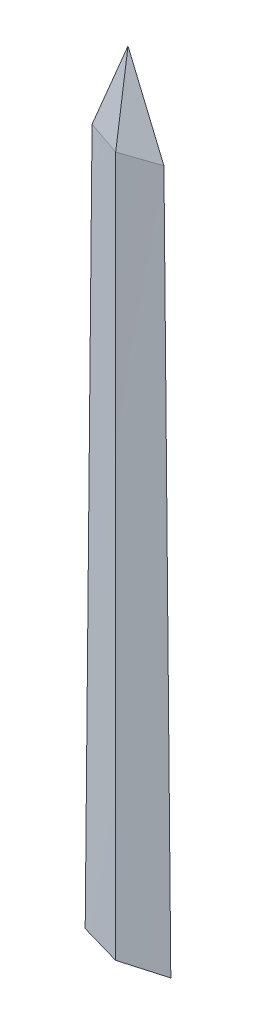
ISO-10303-21;
HEADER;
FILE_DESCRIPTION(('STEP AP214'),'2;1');
FILE_NAME('part.step','',(''),(''),'','','');
FILE_SCHEMA(('AUTOMOTIVE_DESIGN { 1 0 10303 214 1 1 1 1 }'));
ENDSEC;
DATA;
#1=APPLICATION_CONTEXT('core data for automotive mechanical design processes');
#2=APPLICATION_PROTOCOL_DEFINITION('international standard','automotive_design',2000,#1);
#3=PRODUCT_CONTEXT('',#1,'mechanical');
#4=PRODUCT('Part','Part','',(#3));
#5=PRODUCT_RELATED_PRODUCT_CATEGORY('part','',(#4));
#6=PRODUCT_DEFINITION_FORMATION('','',#4);
#7=PRODUCT_DEFINITION_CONTEXT('part definition',#1,'design');
#8=PRODUCT_DEFINITION('design','',#6,#7);
#9=PRODUCT_DEFINITION_SHAPE('','',#8);
#10=(LENGTH_UNIT() NAMED_UNIT(*) SI_UNIT(.MILLI.,.METRE.));
#11=(NAMED_UNIT(*) PLANE_ANGLE_UNIT() SI_UNIT($,.RADIAN.));
#12=(NAMED_UNIT(*) SI_UNIT($,.STERADIAN.) SOLID_ANGLE_UNIT());
#13=UNCERTAINTY_MEASURE_WITH_UNIT(LENGTH_MEASURE(1.E-05),#10,'distance_accuracy_value','');
#14=(GEOMETRIC_REPRESENTATION_CONTEXT(3) GLOBAL_UNCERTAINTY_ASSIGNED_CONTEXT((#13)) GLOBAL_UNIT_ASSIGNED_CONTEXT((#10,
#11,#12)) REPRESENTATION_CONTEXT('',''));
#15=CARTESIAN_POINT('',(0.,0.,0.));
#16=DIRECTION('',(0.,0.,1.));
#17=DIRECTION('',(1.,0.,0.));
#18=AXIS2_PLACEMENT_3D('',#15,#16,#17);
#19=CARTESIAN_POINT('',(-32.1030984066137,13.457832355646,-93.6987043311591));
#20=DIRECTION('',(-0.321172823266874,0.13463778349272,-0.937401026696127));
#21=DIRECTION('',(0.946014601230734,0.,-0.3241240106167));
#22=AXIS2_PLACEMENT_3D('',#19,#20,#21);
#23=PLANE('',#22);
#24=DIRECTION('',(0.386610447032503,0.922243114501447,0.));
#25=VECTOR('',#24,1.);
#26=CARTESIAN_POINT('',(181.068628680817,1174.33721565241,0.));
#27=LINE('',#26,#25);
#28=CARTESIAN_POINT('',(148.634785732328,1096.96763455169,0.));
#29=VERTEX_POINT('',#28);
#30=CARTESIAN_POINT('',(181.068628680818,1174.33721565241,0.));
#31=VERTEX_POINT('',#30);
#32=EDGE_CURVE('E118',#29,#31,#27,.T.);
#33=ORIENTED_EDGE('',*,*,#32,.T.);
#34=DIRECTION('',(0.,-0.989842276180155,-0.14216985716561));
#35=VECTOR('',#34,1.);
#36=CARTESIAN_POINT('',(181.068628680818,23.7360188615762,-165.259467835217));
#37=LINE('',#36,#35);
#38=CARTESIAN_POINT('',(181.068628680817,1096.96763455169,-11.1125));
#39=VERTEX_POINT('',#38);
#40=EDGE_CURVE('E12',#31,#39,#37,.T.);
#41=ORIENTED_EDGE('',*,*,#40,.T.);
#42=DIRECTION('',(-0.946014601230734,0.,0.3241240106167));
#43=VECTOR('',#42,1.);
#44=CARTESIAN_POINT('',(181.068628680817,1096.96763455169,-11.1125));
#45=LINE('',#44,#43);
#46=EDGE_CURVE('E120',#39,#29,#45,.T.);
#47=ORIENTED_EDGE('',*,*,#46,.T.);
#48=EDGE_LOOP('',(#33,#41,#47));
#49=FACE_BOUND('',#48,.T.);
#50=ADVANCED_FACE('F61',(#49),#23,.T.);
#51=CARTESIAN_POINT('',(-32.1030984066137,13.457832355646,93.6987043311591));
#52=DIRECTION('',(-0.321172823266874,0.13463778349272,0.937401026696127));
#53=DIRECTION('',(0.946014601230734,0.,0.3241240106167));
#54=AXIS2_PLACEMENT_3D('',#51,#52,#53);
#55=PLANE('',#54);
#56=DIRECTION('',(-0.946014601230734,0.,-0.3241240106167));
#57=VECTOR('',#56,1.);
#58=CARTESIAN_POINT('',(181.068628680817,1096.96763455169,11.1125));
#59=LINE('',#58,#57);
#60=CARTESIAN_POINT('',(181.068628680818,1096.96763455169,11.1125));
#61=VERTEX_POINT('',#60);
#62=EDGE_CURVE('E135',#61,#29,#59,.T.);
#63=ORIENTED_EDGE('',*,*,#62,.F.);
#64=DIRECTION('',(0.,0.989842276180155,-0.14216985716561));
#65=VECTOR('',#64,1.);
#66=CARTESIAN_POINT('',(181.068628680818,23.7360188615762,165.259467835217));
#67=LINE('',#66,#65);
#68=EDGE_CURVE('E71',#61,#31,#67,.T.);
#69=ORIENTED_EDGE('',*,*,#68,.T.);
#70=ORIENTED_EDGE('',*,*,#32,.F.);
#71=EDGE_LOOP('',(#63,#69,#70));
#72=FACE_BOUND('',#71,.T.);
#73=ADVANCED_FACE('F133',(#72),#55,.T.);
#74=CARTESIAN_POINT('',(142.421230690097,465.168027231046,-11.1125));
#75=DIRECTION('',(0.,-1.,0.));
#76=DIRECTION('',(0.,0.,-1.));
#77=AXIS2_PLACEMENT_3D('',#74,#75,#76);
#78=PLANE('',#77);
#79=CARTESIAN_POINT('',(181.068628680817,465.168027231046,0.));
#80=DIRECTION('',(0.,-1.,0.));
#81=DIRECTION('',(0.,0.,-1.));
#82=AXIS2_PLACEMENT_3D('',#79,#80,#81);
#83=CIRCLE('',#82,4.76250000000001);
#84=CARTESIAN_POINT('',(181.068628680817,465.168027231046,-4.76250000000001));
#85=VERTEX_POINT('',#84);
#86=EDGE_CURVE('E311',#85,#85,#83,.T.);
#87=ORIENTED_EDGE('',*,*,#86,.F.);
#88=EDGE_LOOP('',(#87));
#89=FACE_BOUND('',#88,.T.);
#90=DIRECTION('',(0.96106023622245,0.,0.276338962783115));
#91=VECTOR('',#90,1.);
#92=CARTESIAN_POINT('',(181.068628680817,465.168027231046,-11.1125));
#93=LINE('',#92,#91);
#94=CARTESIAN_POINT('',(181.068628680817,465.168027231046,-11.1125));
#95=VERTEX_POINT('',#94);
#96=CARTESIAN_POINT('',(219.716026671538,465.168027231046,0.));
#97=VERTEX_POINT('',#96);
#98=EDGE_CURVE('E162',#95,#97,#93,.T.);
#99=ORIENTED_EDGE('',*,*,#98,.T.);
#100=DIRECTION('',(0.96106023622245,0.,-0.276338962783115));
#101=VECTOR('',#100,1.);
#102=CARTESIAN_POINT('',(181.068628680817,465.168027231046,11.1125));
#103=LINE('',#102,#101);
#104=CARTESIAN_POINT('',(181.068628680817,465.168027231046,11.1125));
#105=VERTEX_POINT('',#104);
#106=EDGE_CURVE('E138',#105,#97,#103,.T.);
#107=ORIENTED_EDGE('',*,*,#106,.F.);
#108=DIRECTION('',(0.96106023622245,0.,0.276338962783115));
#109=VECTOR('',#108,1.);
#110=CARTESIAN_POINT('',(142.421230690097,465.168027231046,0.));
#111=LINE('',#110,#109);
#112=CARTESIAN_POINT('',(142.421230690097,465.168027231046,0.));
#113=VERTEX_POINT('',#112);
#114=EDGE_CURVE('E79',#113,#105,#111,.T.);
#115=ORIENTED_EDGE('',*,*,#114,.F.);
#116=DIRECTION('',(0.96106023622245,0.,-0.276338962783115));
#117=VECTOR('',#116,1.);
#118=CARTESIAN_POINT('',(142.421230690097,465.168027231046,0.));
#119=LINE('',#118,#117);
#120=EDGE_CURVE('E87',#113,#95,#119,.T.);
#121=ORIENTED_EDGE('',*,*,#120,.T.);
#122=EDGE_LOOP('',(#99,#107,#115,#121));
#123=FACE_BOUND('',#122,.T.);
#124=ADVANCED_FACE('F63',(#89,#123),#78,.T.);
#125=CARTESIAN_POINT('',(219.716026671538,465.168027231046,0.));
#126=CARTESIAN_POINT('',(213.502471629307,1096.96763455169,0.));
#127=CARTESIAN_POINT('',(213.274793673085,465.168027231046,1.85208333333331));
#128=CARTESIAN_POINT('',(208.096831137892,1096.96763455169,1.85208333333331));
#129=CARTESIAN_POINT('',(206.833560674631,465.168027231046,3.70416666666664));
#130=CARTESIAN_POINT('',(202.691190646477,1096.96763455169,3.70416666666663));
#131=CARTESIAN_POINT('',(193.951094677724,465.168027231046,7.4083333333333));
#132=CARTESIAN_POINT('',(191.879909663647,1096.96763455169,7.4083333333333));
#133=CARTESIAN_POINT('',(187.509861679271,465.168027231046,9.26041666666665));
#134=CARTESIAN_POINT('',(186.474269172232,1096.96763455169,9.26041666666665));
#135=CARTESIAN_POINT('',(181.068628680817,465.168027231046,11.1125));
#136=CARTESIAN_POINT('',(181.068628680817,1096.96763455169,11.1125));
#137=B_SPLINE_SURFACE_WITH_KNOTS('',3,1,((#125,#126),(#127,#128),(#129,#130),(#131,#132),(#133,
#134),(#135,#136)),.UNSPECIFIED.,.F.,.F.,.F.,(4,2,4),(2,2),(0.,0.5,1.),(0.,1.),.UNSPECIFIED.);
#138=DIRECTION('',(-0.00983421721197636,0.99995164291671,0.));
#139=VECTOR('',#138,1.);
#140=CARTESIAN_POINT('',(219.716026671538,465.168027231046,0.));
#141=LINE('',#140,#139);
#142=CARTESIAN_POINT('',(213.502471629307,1096.96763455169,0.));
#143=VERTEX_POINT('',#142);
#144=EDGE_CURVE('E158',#97,#143,#141,.T.);
#145=DIRECTION('',(-0.946014601230734,0.,0.3241240106167));
#146=VECTOR('',#145,1.);
#147=CARTESIAN_POINT('',(213.502471629307,1096.96763455169,0.));
#148=LINE('',#147,#146);
#149=EDGE_CURVE('E129',#143,#61,#148,.T.);
#150=DIRECTION('',(0.,1.,0.));
#151=VECTOR('',#150,1.);
#152=CARTESIAN_POINT('',(181.068628680817,781.067830891368,11.1125));
#153=LINE('',#152,#151);
#154=EDGE_CURVE('E242',#105,#61,#153,.T.);
#155=ORIENTED_EDGE('',*,*,#106,.T.);
#156=ORIENTED_EDGE('',*,*,#144,.T.);
#157=ORIENTED_EDGE('',*,*,#149,.T.);
#158=ORIENTED_EDGE('',*,*,#154,.F.);
#159=EDGE_LOOP('',(#155,#156,#157,#158));
#160=FACE_BOUND('',#159,.T.);
#161=ADVANCED_FACE('F200',(#160),#137,.F.);
#162=CARTESIAN_POINT('',(181.068628680817,465.168027231046,11.1125));
#163=CARTESIAN_POINT('',(181.068628680817,1096.96763455169,11.1125));
#164=CARTESIAN_POINT('',(174.627395682364,465.168027231046,9.26041666666668));
#165=CARTESIAN_POINT('',(175.662988189402,1096.96763455169,9.26041666666663));
#166=CARTESIAN_POINT('',(168.186162683911,465.168027231046,7.40833333333335));
#167=CARTESIAN_POINT('',(170.257347697988,1096.96763455169,7.40833333333328));
#168=CARTESIAN_POINT('',(155.303696687004,465.168027231046,3.70416666666668));
#169=CARTESIAN_POINT('',(159.446066715158,1096.96763455169,3.70416666666661));
#170=CARTESIAN_POINT('',(148.86246368855,465.168027231046,1.85208333333334));
#171=CARTESIAN_POINT('',(154.040426223743,1096.96763455169,1.8520833333333));
#172=CARTESIAN_POINT('',(142.421230690097,465.168027231046,0.));
#173=CARTESIAN_POINT('',(148.634785732328,1096.96763455169,0.));
#174=B_SPLINE_SURFACE_WITH_KNOTS('',3,1,((#162,#163),(#164,#165),(#166,#167),(#168,#169),(#170,
#171),(#172,#173)),.UNSPECIFIED.,.F.,.F.,.F.,(4,2,4),(2,2),(0.,0.5,1.),(0.,1.),.UNSPECIFIED.);
#175=DIRECTION('',(0.00983421721197636,0.99995164291671,0.));
#176=VECTOR('',#175,1.);
#177=CARTESIAN_POINT('',(145.528008211213,781.067830891368,0.));
#178=LINE('',#177,#176);
#179=EDGE_CURVE('E147',#113,#29,#178,.T.);
#180=ORIENTED_EDGE('',*,*,#114,.T.);
#181=ORIENTED_EDGE('',*,*,#154,.T.);
#182=ORIENTED_EDGE('',*,*,#62,.T.);
#183=ORIENTED_EDGE('',*,*,#179,.F.);
#184=EDGE_LOOP('',(#180,#181,#182,#183));
#185=FACE_BOUND('',#184,.T.);
#186=ADVANCED_FACE('F210',(#185),#174,.F.);
#187=CARTESIAN_POINT('',(219.716026671538,465.168027231046,0.));
#188=CARTESIAN_POINT('',(213.502471629307,1096.96763455169,0.));
#189=CARTESIAN_POINT('',(213.274793673085,465.168027231046,-1.85208333333331));
#190=CARTESIAN_POINT('',(208.096831137892,1096.96763455169,-1.85208333333331));
#191=CARTESIAN_POINT('',(206.833560674631,465.168027231046,-3.70416666666664));
#192=CARTESIAN_POINT('',(202.691190646477,1096.96763455169,-3.70416666666663));
#193=CARTESIAN_POINT('',(193.951094677724,465.168027231046,-7.4083333333333));
#194=CARTESIAN_POINT('',(191.879909663647,1096.96763455169,-7.4083333333333));
#195=CARTESIAN_POINT('',(187.509861679271,465.168027231046,-9.26041666666665));
#196=CARTESIAN_POINT('',(186.474269172232,1096.96763455169,-9.26041666666665));
#197=CARTESIAN_POINT('',(181.068628680817,465.168027231046,-11.1125));
#198=CARTESIAN_POINT('',(181.068628680817,1096.96763455169,-11.1125));
#199=B_SPLINE_SURFACE_WITH_KNOTS('',3,1,((#187,#188),(#189,#190),(#191,#192),(#193,#194),(#195,
#196),(#197,#198)),.UNSPECIFIED.,.F.,.F.,.F.,(4,2,4),(2,2),(0.,0.5,1.),(0.,1.),.UNSPECIFIED.);
#200=DIRECTION('',(0.,1.,0.));
#201=VECTOR('',#200,1.);
#202=CARTESIAN_POINT('',(181.068628680817,781.067830891368,-11.1125));
#203=LINE('',#202,#201);
#204=EDGE_CURVE('E165',#95,#39,#203,.T.);
#205=DIRECTION('',(-0.946014601230734,0.,-0.3241240106167));
#206=VECTOR('',#205,1.);
#207=CARTESIAN_POINT('',(213.502471629307,1096.96763455169,0.));
#208=LINE('',#207,#206);
#209=EDGE_CURVE('E65',#143,#39,#208,.T.);
#210=ORIENTED_EDGE('',*,*,#98,.F.);
#211=ORIENTED_EDGE('',*,*,#204,.T.);
#212=ORIENTED_EDGE('',*,*,#209,.F.);
#213=ORIENTED_EDGE('',*,*,#144,.F.);
#214=EDGE_LOOP('',(#210,#211,#212,#213));
#215=FACE_BOUND('',#214,.T.);
#216=ADVANCED_FACE('F195',(#215),#199,.T.);
#217=CARTESIAN_POINT('',(181.068628680817,465.168027231046,-11.1125));
#218=CARTESIAN_POINT('',(181.068628680817,1096.96763455169,-11.1125));
#219=CARTESIAN_POINT('',(174.627395682364,465.168027231046,-9.26041666666668));
#220=CARTESIAN_POINT('',(175.662988189402,1096.96763455169,-9.26041666666663));
#221=CARTESIAN_POINT('',(168.186162683911,465.168027231046,-7.40833333333335));
#222=CARTESIAN_POINT('',(170.257347697988,1096.96763455169,-7.40833333333328));
#223=CARTESIAN_POINT('',(155.303696687004,465.168027231046,-3.70416666666668));
#224=CARTESIAN_POINT('',(159.446066715158,1096.96763455169,-3.70416666666661));
#225=CARTESIAN_POINT('',(148.86246368855,465.168027231046,-1.85208333333334));
#226=CARTESIAN_POINT('',(154.040426223743,1096.96763455169,-1.8520833333333));
#227=CARTESIAN_POINT('',(142.421230690097,465.168027231046,0.));
#228=CARTESIAN_POINT('',(148.634785732328,1096.96763455169,0.));
#229=B_SPLINE_SURFACE_WITH_KNOTS('',3,1,((#217,#218),(#219,#220),(#221,#222),(#223,#224),(#225,
#226),(#227,#228)),.UNSPECIFIED.,.F.,.F.,.F.,(4,2,4),(2,2),(0.,0.5,1.),(0.,1.),.UNSPECIFIED.);
#230=ORIENTED_EDGE('',*,*,#120,.F.);
#231=ORIENTED_EDGE('',*,*,#179,.T.);
#232=ORIENTED_EDGE('',*,*,#46,.F.);
#233=ORIENTED_EDGE('',*,*,#204,.F.);
#234=EDGE_LOOP('',(#230,#231,#232,#233));
#235=FACE_BOUND('',#234,.T.);
#236=ADVANCED_FACE('F183',(#235),#229,.T.);
#237=CARTESIAN_POINT('',(69.4582744062542,29.1173705675479,202.726547902408));
#238=DIRECTION('',(0.321172823266876,0.13463778349272,0.937401026696127));
#239=DIRECTION('',(0.946014601230734,0.,-0.324124010616702));
#240=AXIS2_PLACEMENT_3D('',#237,#238,#239);
#241=PLANE('',#240);
#242=ORIENTED_EDGE('',*,*,#68,.F.);
#243=ORIENTED_EDGE('',*,*,#149,.F.);
#244=DIRECTION('',(0.386610447032503,-0.922243114501447,0.));
#245=VECTOR('',#244,1.);
#246=CARTESIAN_POINT('',(213.502471629307,1096.96763455169,0.));
#247=LINE('',#246,#245);
#248=EDGE_CURVE('E111',#31,#143,#247,.T.);
#249=ORIENTED_EDGE('',*,*,#248,.F.);
#250=EDGE_LOOP('',(#242,#243,#249));
#251=FACE_BOUND('',#250,.T.);
#252=ADVANCED_FACE('F127',(#251),#241,.T.);
#253=CARTESIAN_POINT('',(69.4582744062542,29.1173705675479,-202.726547902408));
#254=DIRECTION('',(0.321172823266876,0.13463778349272,-0.937401026696127));
#255=DIRECTION('',(0.946014601230734,0.,0.324124010616702));
#256=AXIS2_PLACEMENT_3D('',#253,#254,#255);
#257=PLANE('',#256);
#258=ORIENTED_EDGE('',*,*,#209,.T.);
#259=ORIENTED_EDGE('',*,*,#40,.F.);
#260=ORIENTED_EDGE('',*,*,#248,.T.);
#261=EDGE_LOOP('',(#258,#259,#260));
#262=FACE_BOUND('',#261,.T.);
#263=ADVANCED_FACE('F109',(#262),#257,.T.);
#264=CARTESIAN_POINT('',(181.068628680817,1100.16802723105,0.));
#265=DIRECTION('',(0.,-1.,0.));
#266=DIRECTION('',(0.,0.,-1.));
#267=AXIS2_PLACEMENT_3D('',#264,#265,#266);
#268=CYLINDRICAL_SURFACE('',#267,4.76250000000001);
#269=CARTESIAN_POINT('',(181.068628680817,1100.16802723105,0.));
#270=DIRECTION('',(0.,-1.,0.));
#271=DIRECTION('',(0.,0.,-1.));
#272=AXIS2_PLACEMENT_3D('',#269,#270,#271);
#273=CIRCLE('',#272,4.76250000000001);
#274=CARTESIAN_POINT('',(181.068628680817,1100.16802723105,-4.76250000000001));
#275=VERTEX_POINT('',#274);
#276=EDGE_CURVE('E131',#275,#275,#273,.T.);
#277=CARTESIAN_POINT('',(181.068628680817,1100.16802723105,-4.76250000000001));
#278=CARTESIAN_POINT('',(181.068628680817,1093.55344389771,-4.76250000000001));
#279=CARTESIAN_POINT('',(181.068628680817,1086.93886056438,-4.76250000000001));
#280=CARTESIAN_POINT('',(181.068628680817,1073.70969389771,-4.76250000000001));
#281=CARTESIAN_POINT('',(181.068628680817,1067.09511056438,-4.76250000000001));
#282=CARTESIAN_POINT('',(181.068628680817,1053.86594389771,-4.76250000000001));
#283=CARTESIAN_POINT('',(181.068628680817,1047.25136056438,-4.76250000000001));
#284=CARTESIAN_POINT('',(181.068628680817,1034.02219389771,-4.76250000000001));
#285=CARTESIAN_POINT('',(181.068628680817,1027.40761056438,-4.76250000000001));
#286=CARTESIAN_POINT('',(181.068628680817,1014.17844389771,-4.76250000000001));
#287=CARTESIAN_POINT('',(181.068628680817,1007.56386056438,-4.76250000000001));
#288=CARTESIAN_POINT('',(181.068628680817,994.334693897713,-4.76250000000001));
#289=CARTESIAN_POINT('',(181.068628680817,987.720110564379,-4.76250000000001));
#290=CARTESIAN_POINT('',(181.068628680817,974.490943897713,-4.76250000000001));
#291=CARTESIAN_POINT('',(181.068628680817,967.876360564379,-4.76250000000001));
#292=CARTESIAN_POINT('',(181.068628680817,954.647193897713,-4.76250000000001));
#293=CARTESIAN_POINT('',(181.068628680817,948.032610564379,-4.76250000000001));
#294=CARTESIAN_POINT('',(181.068628680817,934.803443897713,-4.76250000000001));
#295=CARTESIAN_POINT('',(181.068628680817,928.188860564379,-4.76250000000001));
#296=CARTESIAN_POINT('',(181.068628680817,914.959693897713,-4.76250000000001));
#297=CARTESIAN_POINT('',(181.068628680817,908.345110564379,-4.76250000000001));
#298=CARTESIAN_POINT('',(181.068628680817,895.115943897713,-4.76250000000001));
#299=CARTESIAN_POINT('',(181.068628680817,888.501360564379,-4.76250000000001));
#300=CARTESIAN_POINT('',(181.068628680817,875.272193897713,-4.76250000000001));
#301=CARTESIAN_POINT('',(181.068628680817,868.657610564379,-4.76250000000001));
#302=CARTESIAN_POINT('',(181.068628680817,855.428443897713,-4.76250000000001));
#303=CARTESIAN_POINT('',(181.068628680817,848.813860564379,-4.76250000000001));
#304=CARTESIAN_POINT('',(181.068628680817,835.584693897713,-4.76250000000001));
#305=CARTESIAN_POINT('',(181.068628680817,828.970110564379,-4.76250000000001));
#306=CARTESIAN_POINT('',(181.068628680817,815.740943897713,-4.76250000000001));
#307=CARTESIAN_POINT('',(181.068628680817,809.126360564379,-4.76250000000001));
#308=CARTESIAN_POINT('',(181.068628680817,795.897193897713,-4.76250000000001));
#309=CARTESIAN_POINT('',(181.068628680817,789.282610564379,-4.76250000000001));
#310=CARTESIAN_POINT('',(181.068628680817,776.053443897713,-4.76250000000001));
#311=CARTESIAN_POINT('',(181.068628680817,769.438860564379,-4.76250000000001));
#312=CARTESIAN_POINT('',(181.068628680817,756.209693897713,-4.76250000000001));
#313=CARTESIAN_POINT('',(181.068628680817,749.595110564379,-4.76250000000001));
#314=CARTESIAN_POINT('',(181.068628680817,736.365943897713,-4.76250000000001));
#315=CARTESIAN_POINT('',(181.068628680817,729.751360564379,-4.76250000000001));
#316=CARTESIAN_POINT('',(181.068628680817,716.522193897713,-4.76250000000001));
#317=CARTESIAN_POINT('',(181.068628680817,709.907610564379,-4.76250000000001));
#318=CARTESIAN_POINT('',(181.068628680817,696.678443897713,-4.76250000000001));
#319=CARTESIAN_POINT('',(181.068628680817,690.063860564379,-4.76250000000001));
#320=CARTESIAN_POINT('',(181.068628680817,676.834693897713,-4.76250000000001));
#321=CARTESIAN_POINT('',(181.068628680817,670.220110564379,-4.76250000000001));
#322=CARTESIAN_POINT('',(181.068628680817,656.990943897713,-4.76250000000001));
#323=CARTESIAN_POINT('',(181.068628680817,650.376360564379,-4.76250000000001));
#324=CARTESIAN_POINT('',(181.068628680817,637.147193897713,-4.76250000000001));
#325=CARTESIAN_POINT('',(181.068628680817,630.532610564379,-4.76250000000001));
#326=CARTESIAN_POINT('',(181.068628680817,617.303443897713,-4.76250000000001));
#327=CARTESIAN_POINT('',(181.068628680817,610.688860564379,-4.76250000000001));
#328=CARTESIAN_POINT('',(181.068628680817,597.459693897713,-4.76250000000001));
#329=CARTESIAN_POINT('',(181.068628680817,590.845110564379,-4.76250000000001));
#330=CARTESIAN_POINT('',(181.068628680817,577.615943897713,-4.76250000000001));
#331=CARTESIAN_POINT('',(181.068628680817,571.001360564379,-4.76250000000001));
#332=CARTESIAN_POINT('',(181.068628680817,557.772193897713,-4.76250000000001));
#333=CARTESIAN_POINT('',(181.068628680817,551.157610564379,-4.76250000000001));
#334=CARTESIAN_POINT('',(181.068628680817,537.928443897713,-4.76250000000001));
#335=CARTESIAN_POINT('',(181.068628680817,531.313860564379,-4.76250000000001));
#336=CARTESIAN_POINT('',(181.068628680817,518.084693897713,-4.76250000000001));
#337=CARTESIAN_POINT('',(181.068628680817,511.470110564379,-4.76250000000001));
#338=CARTESIAN_POINT('',(181.068628680817,498.240943897713,-4.76250000000001));
#339=CARTESIAN_POINT('',(181.068628680817,491.626360564379,-4.76250000000001));
#340=CARTESIAN_POINT('',(181.068628680817,478.397193897713,-4.76250000000001));
#341=CARTESIAN_POINT('',(181.068628680817,471.782610564379,-4.76250000000001));
#342=CARTESIAN_POINT('',(181.068628680817,465.168027231046,-4.76250000000001));
#343=B_SPLINE_CURVE_WITH_KNOTS('',3,(#277,#278,#279,#280,#281,#282,#283,#284,#285,#286,#287,
#288,#289,#290,#291,#292,#293,#294,#295,#296,#297,#298,#299,#300,#301,#302,#303,#304,#305,#306,
#307,#308,#309,#310,#311,#312,#313,#314,#315,#316,#317,#318,#319,#320,#321,#322,#323,#324,#325,
#326,#327,#328,#329,#330,#331,#332,#333,#334,#335,#336,#337,#338,#339,#340,#341,#342),
.UNSPECIFIED.,.F.,.F.,(4,2,2,2,2,2,2,2,2,2,2,2,2,2,2,2,2,2,2,2,2,2,2,2,2,2,2,2,2,2,2,2,4),(0.,
19.8437499999999,39.6874999999999,59.5312499999998,79.375,99.2187499999999,119.0625,138.90625,
158.75,178.59375,198.4375,218.28125,238.125,257.96875,277.8125,297.65625,317.5,337.34375,
357.1875,377.03125,396.875,416.71875,436.5625,456.40625,476.25,496.09375,515.9375,535.78125,
555.625,575.46875,595.3125,615.15625,635.),.UNSPECIFIED.);
#344=EDGE_CURVE('BSEAM319',#275,#85,#343,.T.);
#345=ORIENTED_EDGE('',*,*,#276,.F.);
#346=ORIENTED_EDGE('',*,*,#86,.T.);
#347=ORIENTED_EDGE('',*,*,#344,.T.);
#348=ORIENTED_EDGE('',*,*,#344,.F.);
#349=EDGE_LOOP('',(#345,#347,#346,#348));
#350=FACE_BOUND('',#349,.T.);
#351=ADVANCED_FACE('F319',(#350),#268,.F.);
#352=CARTESIAN_POINT('',(181.068628680817,1100.16802723105,0.));
#353=DIRECTION('',(0.,-1.,0.));
#354=DIRECTION('',(0.,0.,-1.));
#355=AXIS2_PLACEMENT_3D('',#352,#353,#354);
#356=PLANE('',#355);
#357=ORIENTED_EDGE('',*,*,#276,.T.);
#358=EDGE_LOOP('',(#357));
#359=FACE_BOUND('',#358,.T.);
#360=ADVANCED_FACE('F317',(#359),#356,.T.);
#361=CLOSED_SHELL('',(#50,#73,#124,#161,#186,#216,#236,#252,#263,#351,#360));
#362=MANIFOLD_SOLID_BREP('B2',#361);
#363=ADVANCED_BREP_SHAPE_REPRESENTATION('',(#18,#362),#14);
#364=SHAPE_DEFINITION_REPRESENTATION(#9,#363);
ENDSEC;
END-ISO-10303-21;
